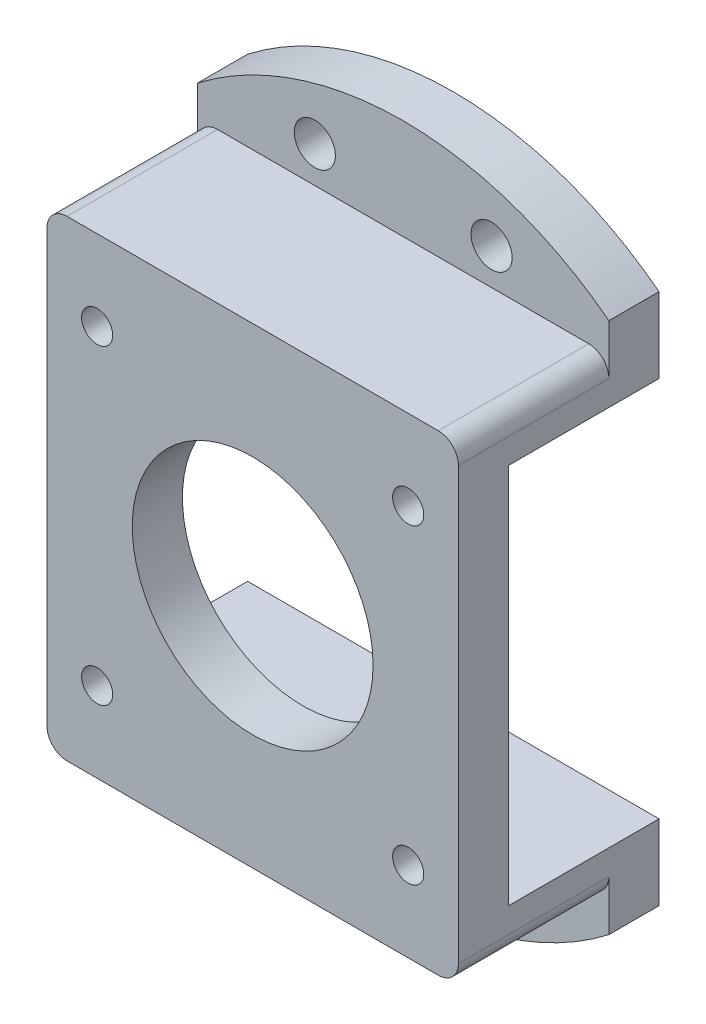
ISO-10303-21;
HEADER;
FILE_DESCRIPTION(('STEP AP214'),'2;1');
FILE_NAME('part.step','',(''),(''),'','','');
FILE_SCHEMA(('AUTOMOTIVE_DESIGN { 1 0 10303 214 1 1 1 1 }'));
ENDSEC;
DATA;
#1=APPLICATION_CONTEXT('core data for automotive mechanical design processes');
#2=APPLICATION_PROTOCOL_DEFINITION('international standard','automotive_design',2000,#1);
#3=PRODUCT_CONTEXT('',#1,'mechanical');
#4=PRODUCT('Part','Part','',(#3));
#5=PRODUCT_RELATED_PRODUCT_CATEGORY('part','',(#4));
#6=PRODUCT_DEFINITION_FORMATION('','',#4);
#7=PRODUCT_DEFINITION_CONTEXT('part definition',#1,'design');
#8=PRODUCT_DEFINITION('design','',#6,#7);
#9=PRODUCT_DEFINITION_SHAPE('','',#8);
#10=(LENGTH_UNIT() NAMED_UNIT(*) SI_UNIT(.MILLI.,.METRE.));
#11=(NAMED_UNIT(*) PLANE_ANGLE_UNIT() SI_UNIT($,.RADIAN.));
#12=(NAMED_UNIT(*) SI_UNIT($,.STERADIAN.) SOLID_ANGLE_UNIT());
#13=UNCERTAINTY_MEASURE_WITH_UNIT(LENGTH_MEASURE(1.E-05),#10,'distance_accuracy_value','');
#14=(GEOMETRIC_REPRESENTATION_CONTEXT(3) GLOBAL_UNCERTAINTY_ASSIGNED_CONTEXT((#13)) GLOBAL_UNIT_ASSIGNED_CONTEXT((#10,
#11,#12)) REPRESENTATION_CONTEXT('',''));
#15=CARTESIAN_POINT('',(0.,0.,0.));
#16=DIRECTION('',(0.,0.,1.));
#17=DIRECTION('',(1.,0.,0.));
#18=AXIS2_PLACEMENT_3D('',#15,#16,#17);
#19=CARTESIAN_POINT('',(-20.5,23.5,-15.));
#20=DIRECTION('',(0.,1.,0.));
#21=DIRECTION('',(0.,0.,1.));
#22=AXIS2_PLACEMENT_3D('',#19,#20,#21);
#23=PLANE('',#22);
#24=DIRECTION('',(-1.,0.,0.));
#25=VECTOR('',#24,1.);
#26=CARTESIAN_POINT('',(0.,23.5,-10.));
#27=LINE('',#26,#25);
#28=CARTESIAN_POINT('',(18.5,23.5,-10.));
#29=VERTEX_POINT('',#28);
#30=CARTESIAN_POINT('',(-18.5,23.5,-10.));
#31=VERTEX_POINT('',#30);
#32=EDGE_CURVE('E210',#29,#31,#27,.T.);
#33=ORIENTED_EDGE('',*,*,#32,.T.);
#34=DIRECTION('',(0.,0.,1.));
#35=VECTOR('',#34,1.);
#36=CARTESIAN_POINT('',(-18.5,23.5,-15.));
#37=LINE('',#36,#35);
#38=CARTESIAN_POINT('',(-18.5,23.5,5.));
#39=VERTEX_POINT('',#38);
#40=EDGE_CURVE('E329',#31,#39,#37,.T.);
#41=ORIENTED_EDGE('',*,*,#40,.T.);
#42=DIRECTION('',(-1.,0.,0.));
#43=VECTOR('',#42,1.);
#44=CARTESIAN_POINT('',(-20.5,23.5,5.));
#45=LINE('',#44,#43);
#46=CARTESIAN_POINT('',(18.5,23.5,5.));
#47=VERTEX_POINT('',#46);
#48=EDGE_CURVE('E239',#47,#39,#45,.T.);
#49=ORIENTED_EDGE('',*,*,#48,.F.);
#50=DIRECTION('',(0.,0.,1.));
#51=VECTOR('',#50,1.);
#52=CARTESIAN_POINT('',(18.5,23.5,-10.));
#53=LINE('',#52,#51);
#54=EDGE_CURVE('E57',#47,#29,#53,.F.);
#55=ORIENTED_EDGE('',*,*,#54,.T.);
#56=EDGE_LOOP('',(#33,#41,#49,#55));
#57=FACE_BOUND('',#56,.T.);
#58=ADVANCED_FACE('F36',(#57),#23,.T.);
#59=CARTESIAN_POINT('',(20.5,0.,5.));
#60=DIRECTION('',(-1.,0.,0.));
#61=DIRECTION('',(0.,0.,1.));
#62=AXIS2_PLACEMENT_3D('',#59,#60,#61);
#63=PLANE('',#62);
#64=DIRECTION('',(0.,1.,0.));
#65=VECTOR('',#64,1.);
#66=CARTESIAN_POINT('',(20.5,0.,5.));
#67=LINE('',#66,#65);
#68=CARTESIAN_POINT('',(20.5,-21.5,5.));
#69=VERTEX_POINT('',#68);
#70=CARTESIAN_POINT('',(20.5,21.5,5.));
#71=VERTEX_POINT('',#70);
#72=EDGE_CURVE('E274',#69,#71,#67,.T.);
#73=ORIENTED_EDGE('',*,*,#72,.F.);
#74=DIRECTION('',(0.,0.,1.));
#75=VECTOR('',#74,1.);
#76=CARTESIAN_POINT('',(20.5,-21.5,-10.));
#77=LINE('',#76,#75);
#78=CARTESIAN_POINT('',(20.5,-21.5,-10.));
#79=VERTEX_POINT('',#78);
#80=EDGE_CURVE('E174',#69,#79,#77,.F.);
#81=ORIENTED_EDGE('',*,*,#80,.T.);
#82=DIRECTION('',(0.,-1.,0.));
#83=VECTOR('',#82,1.);
#84=CARTESIAN_POINT('',(20.5,0.,-10.));
#85=LINE('',#84,#83);
#86=CARTESIAN_POINT('',(20.5,-26.4952825989835,-10.));
#87=VERTEX_POINT('',#86);
#88=EDGE_CURVE('E165',#79,#87,#85,.T.);
#89=ORIENTED_EDGE('',*,*,#88,.T.);
#90=DIRECTION('',(0.,0.,-1.));
#91=VECTOR('',#90,1.);
#92=CARTESIAN_POINT('',(20.5,-26.4952825989835,-10.));
#93=LINE('',#92,#91);
#94=CARTESIAN_POINT('',(20.5,-26.4952825989835,-15.));
#95=VERTEX_POINT('',#94);
#96=EDGE_CURVE('E150',#87,#95,#93,.T.);
#97=ORIENTED_EDGE('',*,*,#96,.T.);
#98=DIRECTION('',(0.,1.,0.));
#99=VECTOR('',#98,1.);
#100=CARTESIAN_POINT('',(20.5,-19.,-15.));
#101=LINE('',#100,#99);
#102=CARTESIAN_POINT('',(20.5,-19.,-15.));
#103=VERTEX_POINT('',#102);
#104=EDGE_CURVE('E228',#95,#103,#101,.T.);
#105=ORIENTED_EDGE('',*,*,#104,.T.);
#106=DIRECTION('',(0.,0.,1.));
#107=VECTOR('',#106,1.);
#108=CARTESIAN_POINT('',(20.5,-19.,-15.));
#109=LINE('',#108,#107);
#110=CARTESIAN_POINT('',(20.5,-19.,0.));
#111=VERTEX_POINT('',#110);
#112=EDGE_CURVE('E233',#103,#111,#109,.T.);
#113=ORIENTED_EDGE('',*,*,#112,.T.);
#114=DIRECTION('',(0.,1.,0.));
#115=VECTOR('',#114,1.);
#116=CARTESIAN_POINT('',(20.5,0.,0.));
#117=LINE('',#116,#115);
#118=CARTESIAN_POINT('',(20.5,19.,0.));
#119=VERTEX_POINT('',#118);
#120=EDGE_CURVE('E298',#111,#119,#117,.T.);
#121=ORIENTED_EDGE('',*,*,#120,.T.);
#122=DIRECTION('',(0.,0.,1.));
#123=VECTOR('',#122,1.);
#124=CARTESIAN_POINT('',(20.5,19.,-15.));
#125=LINE('',#124,#123);
#126=CARTESIAN_POINT('',(20.5,19.,-15.));
#127=VERTEX_POINT('',#126);
#128=EDGE_CURVE('E253',#127,#119,#125,.T.);
#129=ORIENTED_EDGE('',*,*,#128,.F.);
#130=DIRECTION('',(0.,1.,0.));
#131=VECTOR('',#130,1.);
#132=CARTESIAN_POINT('',(20.5,19.,-15.));
#133=LINE('',#132,#131);
#134=CARTESIAN_POINT('',(20.5,26.4952825989835,-15.));
#135=VERTEX_POINT('',#134);
#136=EDGE_CURVE('E248',#127,#135,#133,.T.);
#137=ORIENTED_EDGE('',*,*,#136,.T.);
#138=DIRECTION('',(0.,0.,-1.));
#139=VECTOR('',#138,1.);
#140=CARTESIAN_POINT('',(20.5,26.4952825989835,-10.));
#141=LINE('',#140,#139);
#142=CARTESIAN_POINT('',(20.5,26.4952825989835,-10.));
#143=VERTEX_POINT('',#142);
#144=EDGE_CURVE('E220',#143,#135,#141,.T.);
#145=ORIENTED_EDGE('',*,*,#144,.F.);
#146=DIRECTION('',(0.,1.,0.));
#147=VECTOR('',#146,1.);
#148=CARTESIAN_POINT('',(20.5,0.,-10.));
#149=LINE('',#148,#147);
#150=CARTESIAN_POINT('',(20.5,21.5,-10.));
#151=VERTEX_POINT('',#150);
#152=EDGE_CURVE('E208',#151,#143,#149,.T.);
#153=ORIENTED_EDGE('',*,*,#152,.F.);
#154=DIRECTION('',(0.,0.,1.));
#155=VECTOR('',#154,1.);
#156=CARTESIAN_POINT('',(20.5,21.5,5.));
#157=LINE('',#156,#155);
#158=EDGE_CURVE('E324',#151,#71,#157,.T.);
#159=ORIENTED_EDGE('',*,*,#158,.T.);
#160=EDGE_LOOP('',(#73,#81,#89,#97,#105,#113,#121,#129,#137,#145,#153,#159));
#161=FACE_BOUND('',#160,.T.);
#162=ADVANCED_FACE('F172',(#161),#63,.F.);
#163=CARTESIAN_POINT('',(15.5,15.5,5.));
#164=DIRECTION('',(0.,0.,-1.));
#165=DIRECTION('',(-1.,0.,0.));
#166=AXIS2_PLACEMENT_3D('',#163,#164,#165);
#167=CYLINDRICAL_SURFACE('',#166,1.55);
#168=CARTESIAN_POINT('',(15.5,15.5,5.));
#169=DIRECTION('',(0.,0.,1.));
#170=DIRECTION('',(1.,0.,0.));
#171=AXIS2_PLACEMENT_3D('',#168,#169,#170);
#172=CIRCLE('',#171,1.55);
#173=CARTESIAN_POINT('',(17.05,15.5,5.));
#174=VERTEX_POINT('',#173);
#175=EDGE_CURVE('E271',#174,#174,#172,.T.);
#176=ORIENTED_EDGE('',*,*,#175,.T.);
#177=EDGE_LOOP('',(#176));
#178=FACE_BOUND('',#177,.T.);
#179=CARTESIAN_POINT('',(15.5,15.5,0.));
#180=DIRECTION('',(0.,0.,1.));
#181=DIRECTION('',(1.,0.,0.));
#182=AXIS2_PLACEMENT_3D('',#179,#180,#181);
#183=CIRCLE('',#182,1.55);
#184=CARTESIAN_POINT('',(17.05,15.5,0.));
#185=VERTEX_POINT('',#184);
#186=EDGE_CURVE('E292',#185,#185,#183,.T.);
#187=ORIENTED_EDGE('',*,*,#186,.F.);
#188=EDGE_LOOP('',(#187));
#189=FACE_BOUND('',#188,.T.);
#190=ADVANCED_FACE('F375',(#178,#189),#167,.F.);
#191=CARTESIAN_POINT('',(-15.5,15.5,5.));
#192=DIRECTION('',(0.,0.,-1.));
#193=DIRECTION('',(-1.,0.,0.));
#194=AXIS2_PLACEMENT_3D('',#191,#192,#193);
#195=CYLINDRICAL_SURFACE('',#194,1.55);
#196=CARTESIAN_POINT('',(-15.5,15.5,5.));
#197=DIRECTION('',(0.,0.,1.));
#198=DIRECTION('',(1.,0.,0.));
#199=AXIS2_PLACEMENT_3D('',#196,#197,#198);
#200=CIRCLE('',#199,1.55);
#201=CARTESIAN_POINT('',(-13.95,15.5,5.));
#202=VERTEX_POINT('',#201);
#203=EDGE_CURVE('E268',#202,#202,#200,.T.);
#204=ORIENTED_EDGE('',*,*,#203,.T.);
#205=EDGE_LOOP('',(#204));
#206=FACE_BOUND('',#205,.T.);
#207=CARTESIAN_POINT('',(-15.5,15.5,0.));
#208=DIRECTION('',(0.,0.,1.));
#209=DIRECTION('',(1.,0.,0.));
#210=AXIS2_PLACEMENT_3D('',#207,#208,#209);
#211=CIRCLE('',#210,1.55);
#212=CARTESIAN_POINT('',(-13.95,15.5,0.));
#213=VERTEX_POINT('',#212);
#214=EDGE_CURVE('E289',#213,#213,#211,.T.);
#215=ORIENTED_EDGE('',*,*,#214,.F.);
#216=EDGE_LOOP('',(#215));
#217=FACE_BOUND('',#216,.T.);
#218=ADVANCED_FACE('F397',(#206,#217),#195,.F.);
#219=CARTESIAN_POINT('',(15.5,-15.5,5.));
#220=DIRECTION('',(0.,0.,-1.));
#221=DIRECTION('',(-1.,0.,0.));
#222=AXIS2_PLACEMENT_3D('',#219,#220,#221);
#223=CYLINDRICAL_SURFACE('',#222,1.55);
#224=CARTESIAN_POINT('',(15.5,-15.5,5.));
#225=DIRECTION('',(0.,0.,1.));
#226=DIRECTION('',(1.,0.,0.));
#227=AXIS2_PLACEMENT_3D('',#224,#225,#226);
#228=CIRCLE('',#227,1.55);
#229=CARTESIAN_POINT('',(17.05,-15.5,5.));
#230=VERTEX_POINT('',#229);
#231=EDGE_CURVE('E265',#230,#230,#228,.T.);
#232=ORIENTED_EDGE('',*,*,#231,.T.);
#233=EDGE_LOOP('',(#232));
#234=FACE_BOUND('',#233,.T.);
#235=CARTESIAN_POINT('',(15.5,-15.5,0.));
#236=DIRECTION('',(0.,0.,1.));
#237=DIRECTION('',(1.,0.,0.));
#238=AXIS2_PLACEMENT_3D('',#235,#236,#237);
#239=CIRCLE('',#238,1.55);
#240=CARTESIAN_POINT('',(17.05,-15.5,0.));
#241=VERTEX_POINT('',#240);
#242=EDGE_CURVE('E286',#241,#241,#239,.T.);
#243=ORIENTED_EDGE('',*,*,#242,.F.);
#244=EDGE_LOOP('',(#243));
#245=FACE_BOUND('',#244,.T.);
#246=ADVANCED_FACE('F401',(#234,#245),#223,.F.);
#247=CARTESIAN_POINT('',(-15.5,-15.5,5.));
#248=DIRECTION('',(0.,0.,-1.));
#249=DIRECTION('',(-1.,0.,0.));
#250=AXIS2_PLACEMENT_3D('',#247,#248,#249);
#251=CYLINDRICAL_SURFACE('',#250,1.55);
#252=CARTESIAN_POINT('',(-15.5,-15.5,5.));
#253=DIRECTION('',(0.,0.,1.));
#254=DIRECTION('',(1.,0.,0.));
#255=AXIS2_PLACEMENT_3D('',#252,#253,#254);
#256=CIRCLE('',#255,1.55);
#257=CARTESIAN_POINT('',(-13.95,-15.5,5.));
#258=VERTEX_POINT('',#257);
#259=EDGE_CURVE('E261',#258,#258,#256,.T.);
#260=ORIENTED_EDGE('',*,*,#259,.T.);
#261=EDGE_LOOP('',(#260));
#262=FACE_BOUND('',#261,.T.);
#263=CARTESIAN_POINT('',(-15.5,-15.5,0.));
#264=DIRECTION('',(0.,0.,1.));
#265=DIRECTION('',(1.,0.,0.));
#266=AXIS2_PLACEMENT_3D('',#263,#264,#265);
#267=CIRCLE('',#266,1.55);
#268=CARTESIAN_POINT('',(-13.95,-15.5,0.));
#269=VERTEX_POINT('',#268);
#270=EDGE_CURVE('E283',#269,#269,#267,.T.);
#271=ORIENTED_EDGE('',*,*,#270,.F.);
#272=EDGE_LOOP('',(#271));
#273=FACE_BOUND('',#272,.T.);
#274=ADVANCED_FACE('F405',(#262,#273),#251,.F.);
#275=CARTESIAN_POINT('',(0.,0.,5.));
#276=DIRECTION('',(0.,0.,-1.));
#277=DIRECTION('',(-1.,0.,0.));
#278=AXIS2_PLACEMENT_3D('',#275,#276,#277);
#279=CYLINDRICAL_SURFACE('',#278,12.);
#280=CARTESIAN_POINT('',(0.,0.,5.));
#281=DIRECTION('',(0.,0.,1.));
#282=DIRECTION('',(1.,0.,0.));
#283=AXIS2_PLACEMENT_3D('',#280,#281,#282);
#284=CIRCLE('',#283,12.);
#285=CARTESIAN_POINT('',(12.,0.,5.));
#286=VERTEX_POINT('',#285);
#287=EDGE_CURVE('E258',#286,#286,#284,.T.);
#288=ORIENTED_EDGE('',*,*,#287,.T.);
#289=EDGE_LOOP('',(#288));
#290=FACE_BOUND('',#289,.T.);
#291=CARTESIAN_POINT('',(0.,0.,0.));
#292=DIRECTION('',(0.,0.,1.));
#293=DIRECTION('',(1.,0.,0.));
#294=AXIS2_PLACEMENT_3D('',#291,#292,#293);
#295=CIRCLE('',#294,12.);
#296=CARTESIAN_POINT('',(12.,0.,0.));
#297=VERTEX_POINT('',#296);
#298=EDGE_CURVE('E255',#297,#297,#295,.T.);
#299=ORIENTED_EDGE('',*,*,#298,.F.);
#300=EDGE_LOOP('',(#299));
#301=FACE_BOUND('',#300,.T.);
#302=ADVANCED_FACE('F393',(#290,#301),#279,.F.);
#303=CARTESIAN_POINT('',(-20.5,0.,5.));
#304=DIRECTION('',(-1.,0.,0.));
#305=DIRECTION('',(0.,0.,1.));
#306=AXIS2_PLACEMENT_3D('',#303,#304,#305);
#307=PLANE('',#306);
#308=DIRECTION('',(0.,-1.,0.));
#309=VECTOR('',#308,1.);
#310=CARTESIAN_POINT('',(-20.5,0.,-10.));
#311=LINE('',#310,#309);
#312=CARTESIAN_POINT('',(-20.5,-21.5,-10.));
#313=VERTEX_POINT('',#312);
#314=CARTESIAN_POINT('',(-20.5,-26.4952825989835,-10.));
#315=VERTEX_POINT('',#314);
#316=EDGE_CURVE('E168',#313,#315,#311,.T.);
#317=ORIENTED_EDGE('',*,*,#316,.F.);
#318=DIRECTION('',(0.,0.,1.));
#319=VECTOR('',#318,1.);
#320=CARTESIAN_POINT('',(-20.5,-21.5,5.));
#321=LINE('',#320,#319);
#322=CARTESIAN_POINT('',(-20.5,-21.5,5.));
#323=VERTEX_POINT('',#322);
#324=EDGE_CURVE('E308',#313,#323,#321,.T.);
#325=ORIENTED_EDGE('',*,*,#324,.T.);
#326=DIRECTION('',(0.,1.,0.));
#327=VECTOR('',#326,1.);
#328=CARTESIAN_POINT('',(-20.5,0.,5.));
#329=LINE('',#328,#327);
#330=CARTESIAN_POINT('',(-20.5,21.5,5.));
#331=VERTEX_POINT('',#330);
#332=EDGE_CURVE('E277',#323,#331,#329,.T.);
#333=ORIENTED_EDGE('',*,*,#332,.T.);
#334=DIRECTION('',(0.,0.,1.));
#335=VECTOR('',#334,1.);
#336=CARTESIAN_POINT('',(-20.5,21.5,5.));
#337=LINE('',#336,#335);
#338=CARTESIAN_POINT('',(-20.5,21.5,-10.));
#339=VERTEX_POINT('',#338);
#340=EDGE_CURVE('E280',#331,#339,#337,.F.);
#341=ORIENTED_EDGE('',*,*,#340,.T.);
#342=DIRECTION('',(0.,1.,0.));
#343=VECTOR('',#342,1.);
#344=CARTESIAN_POINT('',(-20.5,0.,-10.));
#345=LINE('',#344,#343);
#346=CARTESIAN_POINT('',(-20.5,26.4952825989835,-10.));
#347=VERTEX_POINT('',#346);
#348=EDGE_CURVE('E202',#339,#347,#345,.T.);
#349=ORIENTED_EDGE('',*,*,#348,.T.);
#350=DIRECTION('',(0.,0.,-1.));
#351=VECTOR('',#350,1.);
#352=CARTESIAN_POINT('',(-20.5,26.4952825989835,-10.));
#353=LINE('',#352,#351);
#354=CARTESIAN_POINT('',(-20.5,26.4952825989835,-15.));
#355=VERTEX_POINT('',#354);
#356=EDGE_CURVE('E212',#347,#355,#353,.T.);
#357=ORIENTED_EDGE('',*,*,#356,.T.);
#358=DIRECTION('',(0.,-1.,0.));
#359=VECTOR('',#358,1.);
#360=CARTESIAN_POINT('',(-20.5,19.,-15.));
#361=LINE('',#360,#359);
#362=CARTESIAN_POINT('',(-20.5,19.,-15.));
#363=VERTEX_POINT('',#362);
#364=EDGE_CURVE('E242',#355,#363,#361,.T.);
#365=ORIENTED_EDGE('',*,*,#364,.T.);
#366=DIRECTION('',(0.,0.,1.));
#367=VECTOR('',#366,1.);
#368=CARTESIAN_POINT('',(-20.5,19.,-15.));
#369=LINE('',#368,#367);
#370=CARTESIAN_POINT('',(-20.5,19.,0.));
#371=VERTEX_POINT('',#370);
#372=EDGE_CURVE('E250',#363,#371,#369,.T.);
#373=ORIENTED_EDGE('',*,*,#372,.T.);
#374=DIRECTION('',(0.,1.,0.));
#375=VECTOR('',#374,1.);
#376=CARTESIAN_POINT('',(-20.5,0.,0.));
#377=LINE('',#376,#375);
#378=CARTESIAN_POINT('',(-20.5,-19.,0.));
#379=VERTEX_POINT('',#378);
#380=EDGE_CURVE('E262',#379,#371,#377,.T.);
#381=ORIENTED_EDGE('',*,*,#380,.F.);
#382=DIRECTION('',(0.,0.,1.));
#383=VECTOR('',#382,1.);
#384=CARTESIAN_POINT('',(-20.5,-19.,-15.));
#385=LINE('',#384,#383);
#386=CARTESIAN_POINT('',(-20.5,-19.,-15.));
#387=VERTEX_POINT('',#386);
#388=EDGE_CURVE('E236',#387,#379,#385,.T.);
#389=ORIENTED_EDGE('',*,*,#388,.F.);
#390=DIRECTION('',(0.,-1.,0.));
#391=VECTOR('',#390,1.);
#392=CARTESIAN_POINT('',(-20.5,-19.,-15.));
#393=LINE('',#392,#391);
#394=CARTESIAN_POINT('',(-20.5,-26.4952825989835,-15.));
#395=VERTEX_POINT('',#394);
#396=EDGE_CURVE('E226',#387,#395,#393,.T.);
#397=ORIENTED_EDGE('',*,*,#396,.T.);
#398=DIRECTION('',(0.,0.,-1.));
#399=VECTOR('',#398,1.);
#400=CARTESIAN_POINT('',(-20.5,-26.4952825989835,-10.));
#401=LINE('',#400,#399);
#402=EDGE_CURVE('E160',#315,#395,#401,.T.);
#403=ORIENTED_EDGE('',*,*,#402,.F.);
#404=EDGE_LOOP('',(#317,#325,#333,#341,#349,#357,#365,#373,#381,#389,#397,#403));
#405=FACE_BOUND('',#404,.T.);
#406=ADVANCED_FACE('F356',(#405),#307,.T.);
#407=CARTESIAN_POINT('',(0.,0.,5.));
#408=DIRECTION('',(0.,0.,1.));
#409=DIRECTION('',(1.,0.,0.));
#410=AXIS2_PLACEMENT_3D('',#407,#408,#409);
#411=PLANE('',#410);
#412=ORIENTED_EDGE('',*,*,#287,.F.);
#413=EDGE_LOOP('',(#412));
#414=FACE_BOUND('',#413,.T.);
#415=ORIENTED_EDGE('',*,*,#259,.F.);
#416=EDGE_LOOP('',(#415));
#417=FACE_BOUND('',#416,.T.);
#418=ORIENTED_EDGE('',*,*,#231,.F.);
#419=EDGE_LOOP('',(#418));
#420=FACE_BOUND('',#419,.T.);
#421=ORIENTED_EDGE('',*,*,#203,.F.);
#422=EDGE_LOOP('',(#421));
#423=FACE_BOUND('',#422,.T.);
#424=ORIENTED_EDGE('',*,*,#175,.F.);
#425=EDGE_LOOP('',(#424));
#426=FACE_BOUND('',#425,.T.);
#427=ORIENTED_EDGE('',*,*,#332,.F.);
#428=CARTESIAN_POINT('',(-18.5,-21.5,5.));
#429=DIRECTION('',(0.,0.,1.));
#430=DIRECTION('',(1.,0.,0.));
#431=AXIS2_PLACEMENT_3D('',#428,#429,#430);
#432=CIRCLE('',#431,2.);
#433=CARTESIAN_POINT('',(-18.5,-23.5,5.));
#434=VERTEX_POINT('',#433);
#435=EDGE_CURVE('E317',#323,#434,#432,.T.);
#436=ORIENTED_EDGE('',*,*,#435,.T.);
#437=DIRECTION('',(1.,0.,0.));
#438=VECTOR('',#437,1.);
#439=CARTESIAN_POINT('',(-20.5,-23.5,5.));
#440=LINE('',#439,#438);
#441=CARTESIAN_POINT('',(18.5,-23.5,5.));
#442=VERTEX_POINT('',#441);
#443=EDGE_CURVE('E223',#434,#442,#440,.T.);
#444=ORIENTED_EDGE('',*,*,#443,.T.);
#445=CARTESIAN_POINT('',(18.5,-21.5,5.));
#446=DIRECTION('',(0.,0.,1.));
#447=DIRECTION('',(1.,0.,0.));
#448=AXIS2_PLACEMENT_3D('',#445,#446,#447);
#449=CIRCLE('',#448,2.);
#450=EDGE_CURVE('E315',#442,#69,#449,.T.);
#451=ORIENTED_EDGE('',*,*,#450,.T.);
#452=ORIENTED_EDGE('',*,*,#72,.T.);
#453=CARTESIAN_POINT('',(18.5,21.5,5.));
#454=DIRECTION('',(0.,0.,1.));
#455=DIRECTION('',(1.,0.,0.));
#456=AXIS2_PLACEMENT_3D('',#453,#454,#455);
#457=CIRCLE('',#456,2.);
#458=EDGE_CURVE('E311',#71,#47,#457,.T.);
#459=ORIENTED_EDGE('',*,*,#458,.T.);
#460=ORIENTED_EDGE('',*,*,#48,.T.);
#461=CARTESIAN_POINT('',(-18.5,21.5,5.));
#462=DIRECTION('',(0.,0.,1.));
#463=DIRECTION('',(1.,0.,0.));
#464=AXIS2_PLACEMENT_3D('',#461,#462,#463);
#465=CIRCLE('',#464,2.);
#466=EDGE_CURVE('E313',#39,#331,#465,.T.);
#467=ORIENTED_EDGE('',*,*,#466,.T.);
#468=EDGE_LOOP('',(#427,#436,#444,#451,#452,#459,#460,#467));
#469=FACE_BOUND('',#468,.T.);
#470=ADVANCED_FACE('F346',(#414,#417,#420,#423,#426,#469),#411,.T.);
#471=CARTESIAN_POINT('',(0.,0.,0.));
#472=DIRECTION('',(0.,0.,1.));
#473=DIRECTION('',(1.,0.,0.));
#474=AXIS2_PLACEMENT_3D('',#471,#472,#473);
#475=PLANE('',#474);
#476=ORIENTED_EDGE('',*,*,#298,.T.);
#477=EDGE_LOOP('',(#476));
#478=FACE_BOUND('',#477,.T.);
#479=ORIENTED_EDGE('',*,*,#270,.T.);
#480=EDGE_LOOP('',(#479));
#481=FACE_BOUND('',#480,.T.);
#482=ORIENTED_EDGE('',*,*,#242,.T.);
#483=EDGE_LOOP('',(#482));
#484=FACE_BOUND('',#483,.T.);
#485=ORIENTED_EDGE('',*,*,#214,.T.);
#486=EDGE_LOOP('',(#485));
#487=FACE_BOUND('',#486,.T.);
#488=ORIENTED_EDGE('',*,*,#186,.T.);
#489=EDGE_LOOP('',(#488));
#490=FACE_BOUND('',#489,.T.);
#491=DIRECTION('',(1.,0.,0.));
#492=VECTOR('',#491,1.);
#493=CARTESIAN_POINT('',(0.,-19.,0.));
#494=LINE('',#493,#492);
#495=EDGE_CURVE('E295',#379,#111,#494,.T.);
#496=ORIENTED_EDGE('',*,*,#495,.F.);
#497=ORIENTED_EDGE('',*,*,#380,.T.);
#498=DIRECTION('',(1.,0.,0.));
#499=VECTOR('',#498,1.);
#500=CARTESIAN_POINT('',(0.,19.,0.));
#501=LINE('',#500,#499);
#502=EDGE_CURVE('E301',#371,#119,#501,.T.);
#503=ORIENTED_EDGE('',*,*,#502,.T.);
#504=ORIENTED_EDGE('',*,*,#120,.F.);
#505=EDGE_LOOP('',(#496,#497,#503,#504));
#506=FACE_BOUND('',#505,.T.);
#507=ADVANCED_FACE('F384',(#478,#481,#484,#487,#490,#506),#475,.F.);
#508=CARTESIAN_POINT('',(-20.5,19.,-15.));
#509=DIRECTION('',(0.,-1.,0.));
#510=DIRECTION('',(0.,0.,-1.));
#511=AXIS2_PLACEMENT_3D('',#508,#509,#510);
#512=PLANE('',#511);
#513=ORIENTED_EDGE('',*,*,#502,.F.);
#514=ORIENTED_EDGE('',*,*,#372,.F.);
#515=DIRECTION('',(1.,0.,0.));
#516=VECTOR('',#515,1.);
#517=CARTESIAN_POINT('',(-20.5,19.,-15.));
#518=LINE('',#517,#516);
#519=EDGE_CURVE('E245',#363,#127,#518,.T.);
#520=ORIENTED_EDGE('',*,*,#519,.T.);
#521=ORIENTED_EDGE('',*,*,#128,.T.);
#522=EDGE_LOOP('',(#513,#514,#520,#521));
#523=FACE_BOUND('',#522,.T.);
#524=ADVANCED_FACE('F381',(#523),#512,.T.);
#525=CARTESIAN_POINT('',(0.,0.,-15.));
#526=DIRECTION('',(0.,0.,-1.));
#527=DIRECTION('',(-1.,0.,0.));
#528=AXIS2_PLACEMENT_3D('',#525,#526,#527);
#529=PLANE('',#528);
#530=ORIENTED_EDGE('',*,*,#364,.F.);
#531=CARTESIAN_POINT('',(0.,0.,-15.));
#532=DIRECTION('',(0.,0.,-1.));
#533=DIRECTION('',(-1.,0.,0.));
#534=AXIS2_PLACEMENT_3D('',#531,#532,#533);
#535=CIRCLE('',#534,33.5);
#536=EDGE_CURVE('E199',#355,#135,#535,.T.);
#537=ORIENTED_EDGE('',*,*,#536,.T.);
#538=ORIENTED_EDGE('',*,*,#136,.F.);
#539=ORIENTED_EDGE('',*,*,#519,.F.);
#540=EDGE_LOOP('',(#530,#537,#538,#539));
#541=FACE_BOUND('',#540,.T.);
#542=CARTESIAN_POINT('',(-8.80698433968602,27.1051107144119,-15.));
#543=DIRECTION('',(0.,0.,-1.));
#544=DIRECTION('',(-1.,0.,0.));
#545=AXIS2_PLACEMENT_3D('',#542,#543,#544);
#546=CIRCLE('',#545,2.05);
#547=CARTESIAN_POINT('',(-10.856984339686,27.1051107144119,-15.));
#548=VERTEX_POINT('',#547);
#549=EDGE_CURVE('E193',#548,#548,#546,.T.);
#550=ORIENTED_EDGE('',*,*,#549,.F.);
#551=EDGE_LOOP('',(#550));
#552=FACE_BOUND('',#551,.T.);
#553=CARTESIAN_POINT('',(8.80698433968602,27.1051107144119,-15.));
#554=DIRECTION('',(0.,0.,-1.));
#555=DIRECTION('',(-1.,0.,0.));
#556=AXIS2_PLACEMENT_3D('',#553,#554,#555);
#557=CIRCLE('',#556,2.05);
#558=CARTESIAN_POINT('',(6.75698433968602,27.1051107144119,-15.));
#559=VERTEX_POINT('',#558);
#560=EDGE_CURVE('E215',#559,#559,#557,.F.);
#561=ORIENTED_EDGE('',*,*,#560,.T.);
#562=EDGE_LOOP('',(#561));
#563=FACE_BOUND('',#562,.T.);
#564=ADVANCED_FACE('F379',(#541,#552,#563),#529,.T.);
#565=CARTESIAN_POINT('',(-20.5,-19.,-15.));
#566=DIRECTION('',(0.,1.,0.));
#567=DIRECTION('',(0.,0.,1.));
#568=AXIS2_PLACEMENT_3D('',#565,#566,#567);
#569=PLANE('',#568);
#570=ORIENTED_EDGE('',*,*,#388,.T.);
#571=ORIENTED_EDGE('',*,*,#495,.T.);
#572=ORIENTED_EDGE('',*,*,#112,.F.);
#573=DIRECTION('',(-1.,0.,0.));
#574=VECTOR('',#573,1.);
#575=CARTESIAN_POINT('',(-20.5,-19.,-15.));
#576=LINE('',#575,#574);
#577=EDGE_CURVE('E230',#103,#387,#576,.T.);
#578=ORIENTED_EDGE('',*,*,#577,.T.);
#579=EDGE_LOOP('',(#570,#571,#572,#578));
#580=FACE_BOUND('',#579,.T.);
#581=ADVANCED_FACE('F428',(#580),#569,.T.);
#582=CARTESIAN_POINT('',(-20.5,-23.5,-15.));
#583=DIRECTION('',(0.,-1.,0.));
#584=DIRECTION('',(0.,0.,-1.));
#585=AXIS2_PLACEMENT_3D('',#582,#583,#584);
#586=PLANE('',#585);
#587=ORIENTED_EDGE('',*,*,#443,.F.);
#588=DIRECTION('',(0.,0.,1.));
#589=VECTOR('',#588,1.);
#590=CARTESIAN_POINT('',(-18.5,-23.5,-15.));
#591=LINE('',#590,#589);
#592=CARTESIAN_POINT('',(-18.5,-23.5,-10.));
#593=VERTEX_POINT('',#592);
#594=EDGE_CURVE('E322',#434,#593,#591,.F.);
#595=ORIENTED_EDGE('',*,*,#594,.T.);
#596=DIRECTION('',(-1.,0.,0.));
#597=VECTOR('',#596,1.);
#598=CARTESIAN_POINT('',(0.,-23.5,-10.));
#599=LINE('',#598,#597);
#600=CARTESIAN_POINT('',(18.5,-23.5,-10.));
#601=VERTEX_POINT('',#600);
#602=EDGE_CURVE('E161',#601,#593,#599,.T.);
#603=ORIENTED_EDGE('',*,*,#602,.F.);
#604=DIRECTION('',(0.,0.,1.));
#605=VECTOR('',#604,1.);
#606=CARTESIAN_POINT('',(18.5,-23.5,5.));
#607=LINE('',#606,#605);
#608=EDGE_CURVE('E319',#601,#442,#607,.T.);
#609=ORIENTED_EDGE('',*,*,#608,.T.);
#610=EDGE_LOOP('',(#587,#595,#603,#609));
#611=FACE_BOUND('',#610,.T.);
#612=ADVANCED_FACE('F341',(#611),#586,.T.);
#613=CARTESIAN_POINT('',(0.,0.,-15.));
#614=DIRECTION('',(0.,0.,1.));
#615=DIRECTION('',(1.,0.,0.));
#616=AXIS2_PLACEMENT_3D('',#613,#614,#615);
#617=PLANE('',#616);
#618=ORIENTED_EDGE('',*,*,#396,.F.);
#619=ORIENTED_EDGE('',*,*,#577,.F.);
#620=ORIENTED_EDGE('',*,*,#104,.F.);
#621=CARTESIAN_POINT('',(0.,0.,-15.));
#622=DIRECTION('',(0.,0.,-1.));
#623=DIRECTION('',(-1.,0.,0.));
#624=AXIS2_PLACEMENT_3D('',#621,#622,#623);
#625=CIRCLE('',#624,33.5);
#626=EDGE_CURVE('E156',#95,#395,#625,.T.);
#627=ORIENTED_EDGE('',*,*,#626,.T.);
#628=EDGE_LOOP('',(#618,#619,#620,#627));
#629=FACE_BOUND('',#628,.T.);
#630=CARTESIAN_POINT('',(8.80698433968602,-27.1051107144119,-15.));
#631=DIRECTION('',(0.,0.,-1.));
#632=DIRECTION('',(-1.,0.,0.));
#633=AXIS2_PLACEMENT_3D('',#630,#631,#632);
#634=CIRCLE('',#633,2.05);
#635=CARTESIAN_POINT('',(6.75698433968602,-27.1051107144119,-15.));
#636=VERTEX_POINT('',#635);
#637=EDGE_CURVE('E186',#636,#636,#634,.T.);
#638=ORIENTED_EDGE('',*,*,#637,.F.);
#639=EDGE_LOOP('',(#638));
#640=FACE_BOUND('',#639,.T.);
#641=CARTESIAN_POINT('',(-8.80698433968602,-27.1051107144119,-15.));
#642=DIRECTION('',(0.,0.,-1.));
#643=DIRECTION('',(-1.,0.,0.));
#644=AXIS2_PLACEMENT_3D('',#641,#642,#643);
#645=CIRCLE('',#644,2.05);
#646=CARTESIAN_POINT('',(-10.856984339686,-27.1051107144119,-15.));
#647=VERTEX_POINT('',#646);
#648=EDGE_CURVE('E189',#647,#647,#645,.F.);
#649=ORIENTED_EDGE('',*,*,#648,.T.);
#650=EDGE_LOOP('',(#649));
#651=FACE_BOUND('',#650,.T.);
#652=ADVANCED_FACE('F431',(#629,#640,#651),#617,.F.);
#653=CARTESIAN_POINT('',(8.80698433968602,27.1051107144119,-10.));
#654=DIRECTION('',(0.,0.,-1.));
#655=DIRECTION('',(-1.,0.,0.));
#656=AXIS2_PLACEMENT_3D('',#653,#654,#655);
#657=CYLINDRICAL_SURFACE('',#656,2.05);
#658=CARTESIAN_POINT('',(8.80698433968602,27.1051107144119,-10.));
#659=DIRECTION('',(0.,0.,-1.));
#660=DIRECTION('',(-1.,0.,0.));
#661=AXIS2_PLACEMENT_3D('',#658,#659,#660);
#662=CIRCLE('',#661,2.05);
#663=CARTESIAN_POINT('',(6.75698433968602,27.1051107144119,-10.));
#664=VERTEX_POINT('',#663);
#665=EDGE_CURVE('E198',#664,#664,#662,.F.);
#666=ORIENTED_EDGE('',*,*,#665,.T.);
#667=EDGE_LOOP('',(#666));
#668=FACE_BOUND('',#667,.T.);
#669=ORIENTED_EDGE('',*,*,#560,.F.);
#670=EDGE_LOOP('',(#669));
#671=FACE_BOUND('',#670,.T.);
#672=ADVANCED_FACE('F458',(#668,#671),#657,.F.);
#673=CARTESIAN_POINT('',(-8.80698433968602,27.1051107144119,-10.));
#674=DIRECTION('',(0.,0.,-1.));
#675=DIRECTION('',(-1.,0.,0.));
#676=AXIS2_PLACEMENT_3D('',#673,#674,#675);
#677=CYLINDRICAL_SURFACE('',#676,2.05);
#678=CARTESIAN_POINT('',(-8.80698433968602,27.1051107144119,-10.));
#679=DIRECTION('',(0.,0.,-1.));
#680=DIRECTION('',(-1.,0.,0.));
#681=AXIS2_PLACEMENT_3D('',#678,#679,#680);
#682=CIRCLE('',#681,2.05);
#683=CARTESIAN_POINT('',(-10.856984339686,27.1051107144119,-10.));
#684=VERTEX_POINT('',#683);
#685=EDGE_CURVE('E195',#684,#684,#682,.T.);
#686=ORIENTED_EDGE('',*,*,#685,.F.);
#687=EDGE_LOOP('',(#686));
#688=FACE_BOUND('',#687,.T.);
#689=ORIENTED_EDGE('',*,*,#549,.T.);
#690=EDGE_LOOP('',(#689));
#691=FACE_BOUND('',#690,.T.);
#692=ADVANCED_FACE('F453',(#688,#691),#677,.F.);
#693=CARTESIAN_POINT('',(0.,0.,-10.));
#694=DIRECTION('',(0.,0.,-1.));
#695=DIRECTION('',(-1.,0.,0.));
#696=AXIS2_PLACEMENT_3D('',#693,#694,#695);
#697=CYLINDRICAL_SURFACE('',#696,33.5);
#698=ORIENTED_EDGE('',*,*,#536,.F.);
#699=ORIENTED_EDGE('',*,*,#356,.F.);
#700=CARTESIAN_POINT('',(0.,0.,-10.));
#701=DIRECTION('',(0.,0.,-1.));
#702=DIRECTION('',(-1.,0.,0.));
#703=AXIS2_PLACEMENT_3D('',#700,#701,#702);
#704=CIRCLE('',#703,33.5);
#705=EDGE_CURVE('E205',#347,#143,#704,.T.);
#706=ORIENTED_EDGE('',*,*,#705,.T.);
#707=ORIENTED_EDGE('',*,*,#144,.T.);
#708=EDGE_LOOP('',(#698,#699,#706,#707));
#709=FACE_BOUND('',#708,.T.);
#710=ADVANCED_FACE('F440',(#709),#697,.T.);
#711=CARTESIAN_POINT('',(0.,0.,-10.));
#712=DIRECTION('',(0.,0.,-1.));
#713=DIRECTION('',(-1.,0.,0.));
#714=AXIS2_PLACEMENT_3D('',#711,#712,#713);
#715=PLANE('',#714);
#716=ORIENTED_EDGE('',*,*,#685,.T.);
#717=EDGE_LOOP('',(#716));
#718=FACE_BOUND('',#717,.T.);
#719=ORIENTED_EDGE('',*,*,#665,.F.);
#720=EDGE_LOOP('',(#719));
#721=FACE_BOUND('',#720,.T.);
#722=ORIENTED_EDGE('',*,*,#348,.F.);
#723=CARTESIAN_POINT('',(-18.5,21.5,-10.));
#724=DIRECTION('',(0.,0.,-1.));
#725=DIRECTION('',(-1.,0.,0.));
#726=AXIS2_PLACEMENT_3D('',#723,#724,#725);
#727=CIRCLE('',#726,2.);
#728=EDGE_CURVE('E44',#339,#31,#727,.T.);
#729=ORIENTED_EDGE('',*,*,#728,.T.);
#730=ORIENTED_EDGE('',*,*,#32,.F.);
#731=CARTESIAN_POINT('',(18.5,21.5,-10.));
#732=DIRECTION('',(0.,0.,-1.));
#733=DIRECTION('',(-1.,0.,0.));
#734=AXIS2_PLACEMENT_3D('',#731,#732,#733);
#735=CIRCLE('',#734,2.);
#736=EDGE_CURVE('E11',#29,#151,#735,.T.);
#737=ORIENTED_EDGE('',*,*,#736,.T.);
#738=ORIENTED_EDGE('',*,*,#152,.T.);
#739=ORIENTED_EDGE('',*,*,#705,.F.);
#740=EDGE_LOOP('',(#722,#729,#730,#737,#738,#739));
#741=FACE_BOUND('',#740,.T.);
#742=ADVANCED_FACE('F441',(#718,#721,#741),#715,.F.);
#743=CARTESIAN_POINT('',(-8.80698433968602,-27.1051107144119,-10.));
#744=DIRECTION('',(0.,0.,-1.));
#745=DIRECTION('',(-1.,0.,0.));
#746=AXIS2_PLACEMENT_3D('',#743,#744,#745);
#747=CYLINDRICAL_SURFACE('',#746,2.05);
#748=CARTESIAN_POINT('',(-8.80698433968602,-27.1051107144119,-10.));
#749=DIRECTION('',(0.,0.,-1.));
#750=DIRECTION('',(-1.,0.,0.));
#751=AXIS2_PLACEMENT_3D('',#748,#749,#750);
#752=CIRCLE('',#751,2.05);
#753=CARTESIAN_POINT('',(-10.856984339686,-27.1051107144119,-10.));
#754=VERTEX_POINT('',#753);
#755=EDGE_CURVE('E176',#754,#754,#752,.F.);
#756=ORIENTED_EDGE('',*,*,#755,.T.);
#757=EDGE_LOOP('',(#756));
#758=FACE_BOUND('',#757,.T.);
#759=ORIENTED_EDGE('',*,*,#648,.F.);
#760=EDGE_LOOP('',(#759));
#761=FACE_BOUND('',#760,.T.);
#762=ADVANCED_FACE('F443',(#758,#761),#747,.F.);
#763=CARTESIAN_POINT('',(8.80698433968602,-27.1051107144119,-10.));
#764=DIRECTION('',(0.,0.,-1.));
#765=DIRECTION('',(-1.,0.,0.));
#766=AXIS2_PLACEMENT_3D('',#763,#764,#765);
#767=CYLINDRICAL_SURFACE('',#766,2.05);
#768=CARTESIAN_POINT('',(8.80698433968602,-27.1051107144119,-10.));
#769=DIRECTION('',(0.,0.,-1.));
#770=DIRECTION('',(-1.,0.,0.));
#771=AXIS2_PLACEMENT_3D('',#768,#769,#770);
#772=CIRCLE('',#771,2.05);
#773=CARTESIAN_POINT('',(6.75698433968602,-27.1051107144119,-10.));
#774=VERTEX_POINT('',#773);
#775=EDGE_CURVE('E179',#774,#774,#772,.T.);
#776=ORIENTED_EDGE('',*,*,#775,.F.);
#777=EDGE_LOOP('',(#776));
#778=FACE_BOUND('',#777,.T.);
#779=ORIENTED_EDGE('',*,*,#637,.T.);
#780=EDGE_LOOP('',(#779));
#781=FACE_BOUND('',#780,.T.);
#782=ADVANCED_FACE('F450',(#778,#781),#767,.F.);
#783=CARTESIAN_POINT('',(0.,0.,-10.));
#784=DIRECTION('',(0.,0.,-1.));
#785=DIRECTION('',(-1.,0.,0.));
#786=AXIS2_PLACEMENT_3D('',#783,#784,#785);
#787=CYLINDRICAL_SURFACE('',#786,33.5);
#788=ORIENTED_EDGE('',*,*,#626,.F.);
#789=ORIENTED_EDGE('',*,*,#96,.F.);
#790=CARTESIAN_POINT('',(0.,0.,-10.));
#791=DIRECTION('',(0.,0.,-1.));
#792=DIRECTION('',(-1.,0.,0.));
#793=AXIS2_PLACEMENT_3D('',#790,#791,#792);
#794=CIRCLE('',#793,33.5);
#795=EDGE_CURVE('E154',#87,#315,#794,.T.);
#796=ORIENTED_EDGE('',*,*,#795,.T.);
#797=ORIENTED_EDGE('',*,*,#402,.T.);
#798=EDGE_LOOP('',(#788,#789,#796,#797));
#799=FACE_BOUND('',#798,.T.);
#800=ADVANCED_FACE('F152',(#799),#787,.T.);
#801=CARTESIAN_POINT('',(0.,0.,-10.));
#802=DIRECTION('',(0.,0.,-1.));
#803=DIRECTION('',(-1.,0.,0.));
#804=AXIS2_PLACEMENT_3D('',#801,#802,#803);
#805=PLANE('',#804);
#806=ORIENTED_EDGE('',*,*,#775,.T.);
#807=EDGE_LOOP('',(#806));
#808=FACE_BOUND('',#807,.T.);
#809=ORIENTED_EDGE('',*,*,#755,.F.);
#810=EDGE_LOOP('',(#809));
#811=FACE_BOUND('',#810,.T.);
#812=ORIENTED_EDGE('',*,*,#88,.F.);
#813=CARTESIAN_POINT('',(18.5,-21.5,-10.));
#814=DIRECTION('',(0.,0.,-1.));
#815=DIRECTION('',(-1.,0.,0.));
#816=AXIS2_PLACEMENT_3D('',#813,#814,#815);
#817=CIRCLE('',#816,2.);
#818=EDGE_CURVE('E334',#79,#601,#817,.T.);
#819=ORIENTED_EDGE('',*,*,#818,.T.);
#820=ORIENTED_EDGE('',*,*,#602,.T.);
#821=CARTESIAN_POINT('',(-18.5,-21.5,-10.));
#822=DIRECTION('',(0.,0.,-1.));
#823=DIRECTION('',(-1.,0.,0.));
#824=AXIS2_PLACEMENT_3D('',#821,#822,#823);
#825=CIRCLE('',#824,2.);
#826=EDGE_CURVE('E332',#593,#313,#825,.T.);
#827=ORIENTED_EDGE('',*,*,#826,.T.);
#828=ORIENTED_EDGE('',*,*,#316,.T.);
#829=ORIENTED_EDGE('',*,*,#795,.F.);
#830=EDGE_LOOP('',(#812,#819,#820,#827,#828,#829));
#831=FACE_BOUND('',#830,.T.);
#832=ADVANCED_FACE('F164',(#808,#811,#831),#805,.F.);
#833=CARTESIAN_POINT('',(-18.5,-21.5,5.));
#834=DIRECTION('',(0.,0.,1.));
#835=DIRECTION('',(1.,0.,0.));
#836=AXIS2_PLACEMENT_3D('',#833,#834,#835);
#837=CYLINDRICAL_SURFACE('',#836,2.);
#838=ORIENTED_EDGE('',*,*,#826,.F.);
#839=ORIENTED_EDGE('',*,*,#594,.F.);
#840=ORIENTED_EDGE('',*,*,#435,.F.);
#841=ORIENTED_EDGE('',*,*,#324,.F.);
#842=EDGE_LOOP('',(#838,#839,#840,#841));
#843=FACE_BOUND('',#842,.T.);
#844=ADVANCED_FACE('F359',(#843),#837,.T.);
#845=CARTESIAN_POINT('',(18.5,-21.5,-15.));
#846=DIRECTION('',(0.,0.,-1.));
#847=DIRECTION('',(-1.,0.,0.));
#848=AXIS2_PLACEMENT_3D('',#845,#846,#847);
#849=CYLINDRICAL_SURFACE('',#848,2.);
#850=ORIENTED_EDGE('',*,*,#818,.F.);
#851=ORIENTED_EDGE('',*,*,#80,.F.);
#852=ORIENTED_EDGE('',*,*,#450,.F.);
#853=ORIENTED_EDGE('',*,*,#608,.F.);
#854=EDGE_LOOP('',(#850,#851,#852,#853));
#855=FACE_BOUND('',#854,.T.);
#856=ADVANCED_FACE('F343',(#855),#849,.T.);
#857=CARTESIAN_POINT('',(-18.5,21.5,-15.));
#858=DIRECTION('',(0.,0.,1.));
#859=DIRECTION('',(1.,0.,0.));
#860=AXIS2_PLACEMENT_3D('',#857,#858,#859);
#861=CYLINDRICAL_SURFACE('',#860,2.);
#862=ORIENTED_EDGE('',*,*,#728,.F.);
#863=ORIENTED_EDGE('',*,*,#340,.F.);
#864=ORIENTED_EDGE('',*,*,#466,.F.);
#865=ORIENTED_EDGE('',*,*,#40,.F.);
#866=EDGE_LOOP('',(#862,#863,#864,#865));
#867=FACE_BOUND('',#866,.T.);
#868=ADVANCED_FACE('F353',(#867),#861,.T.);
#869=CARTESIAN_POINT('',(18.5,21.5,5.));
#870=DIRECTION('',(0.,0.,-1.));
#871=DIRECTION('',(-1.,0.,0.));
#872=AXIS2_PLACEMENT_3D('',#869,#870,#871);
#873=CYLINDRICAL_SURFACE('',#872,2.);
#874=ORIENTED_EDGE('',*,*,#736,.F.);
#875=ORIENTED_EDGE('',*,*,#54,.F.);
#876=ORIENTED_EDGE('',*,*,#458,.F.);
#877=ORIENTED_EDGE('',*,*,#158,.F.);
#878=EDGE_LOOP('',(#874,#875,#876,#877));
#879=FACE_BOUND('',#878,.T.);
#880=ADVANCED_FACE('F38',(#879),#873,.T.);
#881=CLOSED_SHELL('',(#58,#162,#190,#218,#246,#274,#302,#406,#470,#507,#524,#564,#581,#612,#652,
#672,#692,#710,#742,#762,#782,#800,#832,#844,#856,#868,#880));
#882=MANIFOLD_SOLID_BREP('B2',#881);
#883=ADVANCED_BREP_SHAPE_REPRESENTATION('',(#18,#882),#14);
#884=SHAPE_DEFINITION_REPRESENTATION(#9,#883);
ENDSEC;
END-ISO-10303-21;
